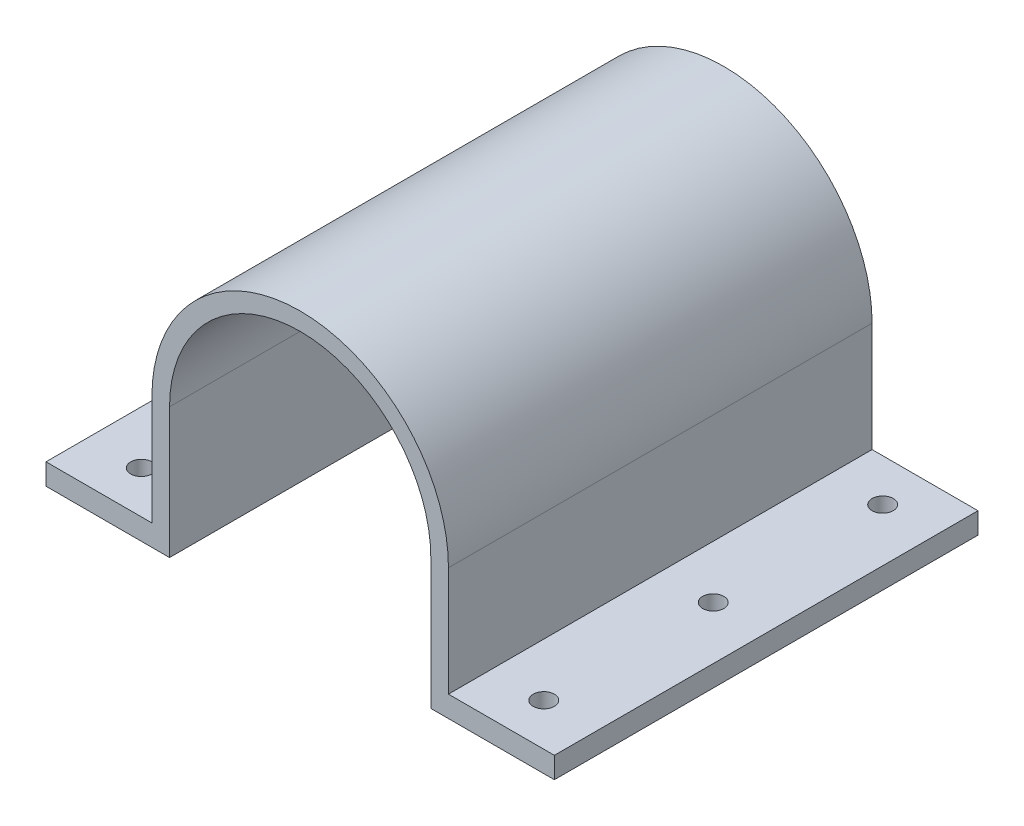
ISO-10303-21;
HEADER;
FILE_DESCRIPTION(('STEP AP214'),'2;1');
FILE_NAME('part.step','',(''),(''),'','','');
FILE_SCHEMA(('AUTOMOTIVE_DESIGN { 1 0 10303 214 1 1 1 1 }'));
ENDSEC;
DATA;
#1=APPLICATION_CONTEXT('core data for automotive mechanical design processes');
#2=APPLICATION_PROTOCOL_DEFINITION('international standard','automotive_design',2000,#1);
#3=PRODUCT_CONTEXT('',#1,'mechanical');
#4=PRODUCT('Part','Part','',(#3));
#5=PRODUCT_RELATED_PRODUCT_CATEGORY('part','',(#4));
#6=PRODUCT_DEFINITION_FORMATION('','',#4);
#7=PRODUCT_DEFINITION_CONTEXT('part definition',#1,'design');
#8=PRODUCT_DEFINITION('design','',#6,#7);
#9=PRODUCT_DEFINITION_SHAPE('','',#8);
#10=(LENGTH_UNIT() NAMED_UNIT(*) SI_UNIT(.MILLI.,.METRE.));
#11=(NAMED_UNIT(*) PLANE_ANGLE_UNIT() SI_UNIT($,.RADIAN.));
#12=(NAMED_UNIT(*) SI_UNIT($,.STERADIAN.) SOLID_ANGLE_UNIT());
#13=UNCERTAINTY_MEASURE_WITH_UNIT(LENGTH_MEASURE(1.E-05),#10,'distance_accuracy_value','');
#14=(GEOMETRIC_REPRESENTATION_CONTEXT(3) GLOBAL_UNCERTAINTY_ASSIGNED_CONTEXT((#13)) GLOBAL_UNIT_ASSIGNED_CONTEXT((#10,
#11,#12)) REPRESENTATION_CONTEXT('',''));
#15=CARTESIAN_POINT('',(0.,0.,0.));
#16=DIRECTION('',(0.,0.,1.));
#17=DIRECTION('',(1.,0.,0.));
#18=AXIS2_PLACEMENT_3D('',#15,#16,#17);
#19=CARTESIAN_POINT('',(-15.5,0.,60.));
#20=DIRECTION('',(0.,0.,-1.));
#21=DIRECTION('',(-1.,0.,0.));
#22=AXIS2_PLACEMENT_3D('',#19,#20,#21);
#23=CYLINDRICAL_SURFACE('',#22,1.65);
#24=CARTESIAN_POINT('',(-15.5,0.,0.));
#25=DIRECTION('',(0.,0.,1.));
#26=DIRECTION('',(1.,0.,0.));
#27=AXIS2_PLACEMENT_3D('',#24,#25,#26);
#28=CIRCLE('',#27,1.65);
#29=CARTESIAN_POINT('',(-13.85,0.,0.));
#30=VERTEX_POINT('',#29);
#31=EDGE_CURVE('E156',#30,#30,#28,.T.);
#32=ORIENTED_EDGE('',*,*,#31,.F.);
#33=EDGE_LOOP('',(#32));
#34=FACE_BOUND('',#33,.T.);
#35=CARTESIAN_POINT('',(-15.5,0.,3.));
#36=DIRECTION('',(0.,0.,1.));
#37=DIRECTION('',(1.,0.,0.));
#38=AXIS2_PLACEMENT_3D('',#35,#36,#37);
#39=CIRCLE('',#38,1.65);
#40=CARTESIAN_POINT('',(-13.85,0.,3.));
#41=VERTEX_POINT('',#40);
#42=EDGE_CURVE('E230',#41,#41,#39,.T.);
#43=ORIENTED_EDGE('',*,*,#42,.T.);
#44=EDGE_LOOP('',(#43));
#45=FACE_BOUND('',#44,.T.);
#46=ADVANCED_FACE('F40',(#34,#45),#23,.F.);
#47=CARTESIAN_POINT('',(0.,7.,60.));
#48=DIRECTION('',(0.,0.,-1.));
#49=DIRECTION('',(-1.,0.,0.));
#50=AXIS2_PLACEMENT_3D('',#47,#48,#49);
#51=CYLINDRICAL_SURFACE('',#50,6.15);
#52=CARTESIAN_POINT('',(0.,7.,0.));
#53=DIRECTION('',(0.,0.,1.));
#54=DIRECTION('',(1.,0.,0.));
#55=AXIS2_PLACEMENT_3D('',#52,#53,#54);
#56=CIRCLE('',#55,6.15);
#57=CARTESIAN_POINT('',(6.15,7.,0.));
#58=VERTEX_POINT('',#57);
#59=EDGE_CURVE('E212',#58,#58,#56,.T.);
#60=ORIENTED_EDGE('',*,*,#59,.F.);
#61=EDGE_LOOP('',(#60));
#62=FACE_BOUND('',#61,.T.);
#63=CARTESIAN_POINT('',(0.,7.,3.));
#64=DIRECTION('',(0.,0.,1.));
#65=DIRECTION('',(1.,0.,0.));
#66=AXIS2_PLACEMENT_3D('',#63,#64,#65);
#67=CIRCLE('',#66,6.15);
#68=CARTESIAN_POINT('',(6.15,7.,3.));
#69=VERTEX_POINT('',#68);
#70=EDGE_CURVE('E233',#69,#69,#67,.T.);
#71=ORIENTED_EDGE('',*,*,#70,.T.);
#72=EDGE_LOOP('',(#71));
#73=FACE_BOUND('',#72,.T.);
#74=ADVANCED_FACE('F330',(#62,#73),#51,.F.);
#75=CARTESIAN_POINT('',(-7.75,13.4233937586588,60.));
#76=DIRECTION('',(0.,0.,-1.));
#77=DIRECTION('',(-1.,0.,0.));
#78=AXIS2_PLACEMENT_3D('',#75,#76,#77);
#79=CYLINDRICAL_SURFACE('',#78,1.65);
#80=CARTESIAN_POINT('',(-7.75,13.4233937586588,0.));
#81=DIRECTION('',(0.,0.,1.));
#82=DIRECTION('',(1.,0.,0.));
#83=AXIS2_PLACEMENT_3D('',#80,#81,#82);
#84=CIRCLE('',#83,1.65);
#85=CARTESIAN_POINT('',(-6.1,13.4233937586588,0.));
#86=VERTEX_POINT('',#85);
#87=EDGE_CURVE('E215',#86,#86,#84,.T.);
#88=ORIENTED_EDGE('',*,*,#87,.F.);
#89=EDGE_LOOP('',(#88));
#90=FACE_BOUND('',#89,.T.);
#91=CARTESIAN_POINT('',(-7.75,13.4233937586588,3.));
#92=DIRECTION('',(0.,0.,1.));
#93=DIRECTION('',(1.,0.,0.));
#94=AXIS2_PLACEMENT_3D('',#91,#92,#93);
#95=CIRCLE('',#94,1.65);
#96=CARTESIAN_POINT('',(-6.1,13.4233937586588,3.));
#97=VERTEX_POINT('',#96);
#98=EDGE_CURVE('E236',#97,#97,#95,.T.);
#99=ORIENTED_EDGE('',*,*,#98,.T.);
#100=EDGE_LOOP('',(#99));
#101=FACE_BOUND('',#100,.T.);
#102=ADVANCED_FACE('F336',(#90,#101),#79,.F.);
#103=CARTESIAN_POINT('',(7.75,13.4233937586588,60.));
#104=DIRECTION('',(0.,0.,-1.));
#105=DIRECTION('',(-1.,0.,0.));
#106=AXIS2_PLACEMENT_3D('',#103,#104,#105);
#107=CYLINDRICAL_SURFACE('',#106,1.65);
#108=CARTESIAN_POINT('',(7.75,13.4233937586588,0.));
#109=DIRECTION('',(0.,0.,1.));
#110=DIRECTION('',(1.,0.,0.));
#111=AXIS2_PLACEMENT_3D('',#108,#109,#110);
#112=CIRCLE('',#111,1.65);
#113=CARTESIAN_POINT('',(9.4,13.4233937586588,0.));
#114=VERTEX_POINT('',#113);
#115=EDGE_CURVE('E218',#114,#114,#112,.T.);
#116=ORIENTED_EDGE('',*,*,#115,.F.);
#117=EDGE_LOOP('',(#116));
#118=FACE_BOUND('',#117,.T.);
#119=CARTESIAN_POINT('',(7.75,13.4233937586588,3.));
#120=DIRECTION('',(0.,0.,1.));
#121=DIRECTION('',(1.,0.,0.));
#122=AXIS2_PLACEMENT_3D('',#119,#120,#121);
#123=CIRCLE('',#122,1.65);
#124=CARTESIAN_POINT('',(9.4,13.4233937586588,3.));
#125=VERTEX_POINT('',#124);
#126=EDGE_CURVE('E239',#125,#125,#123,.T.);
#127=ORIENTED_EDGE('',*,*,#126,.T.);
#128=EDGE_LOOP('',(#127));
#129=FACE_BOUND('',#128,.T.);
#130=ADVANCED_FACE('F425',(#118,#129),#107,.F.);
#131=CARTESIAN_POINT('',(15.5,0.,60.));
#132=DIRECTION('',(0.,0.,-1.));
#133=DIRECTION('',(-1.,0.,0.));
#134=AXIS2_PLACEMENT_3D('',#131,#132,#133);
#135=CYLINDRICAL_SURFACE('',#134,1.65);
#136=CARTESIAN_POINT('',(15.5,0.,0.));
#137=DIRECTION('',(0.,0.,1.));
#138=DIRECTION('',(1.,0.,0.));
#139=AXIS2_PLACEMENT_3D('',#136,#137,#138);
#140=CIRCLE('',#139,1.65);
#141=CARTESIAN_POINT('',(17.15,0.,0.));
#142=VERTEX_POINT('',#141);
#143=EDGE_CURVE('E221',#142,#142,#140,.T.);
#144=ORIENTED_EDGE('',*,*,#143,.F.);
#145=EDGE_LOOP('',(#144));
#146=FACE_BOUND('',#145,.T.);
#147=CARTESIAN_POINT('',(15.5,0.,3.));
#148=DIRECTION('',(0.,0.,1.));
#149=DIRECTION('',(1.,0.,0.));
#150=AXIS2_PLACEMENT_3D('',#147,#148,#149);
#151=CIRCLE('',#150,1.65);
#152=CARTESIAN_POINT('',(17.15,0.,3.));
#153=VERTEX_POINT('',#152);
#154=EDGE_CURVE('E242',#153,#153,#151,.T.);
#155=ORIENTED_EDGE('',*,*,#154,.T.);
#156=EDGE_LOOP('',(#155));
#157=FACE_BOUND('',#156,.T.);
#158=ADVANCED_FACE('F421',(#146,#157),#135,.F.);
#159=CARTESIAN_POINT('',(7.75000000000001,-13.4233937586588,60.));
#160=DIRECTION('',(0.,0.,-1.));
#161=DIRECTION('',(-1.,0.,0.));
#162=AXIS2_PLACEMENT_3D('',#159,#160,#161);
#163=CYLINDRICAL_SURFACE('',#162,1.65);
#164=CARTESIAN_POINT('',(7.75000000000001,-13.4233937586588,0.));
#165=DIRECTION('',(0.,0.,1.));
#166=DIRECTION('',(1.,0.,0.));
#167=AXIS2_PLACEMENT_3D('',#164,#165,#166);
#168=CIRCLE('',#167,1.65);
#169=CARTESIAN_POINT('',(9.40000000000001,-13.4233937586588,0.));
#170=VERTEX_POINT('',#169);
#171=EDGE_CURVE('E224',#170,#170,#168,.T.);
#172=ORIENTED_EDGE('',*,*,#171,.F.);
#173=EDGE_LOOP('',(#172));
#174=FACE_BOUND('',#173,.T.);
#175=CARTESIAN_POINT('',(7.75000000000001,-13.4233937586588,3.));
#176=DIRECTION('',(0.,0.,1.));
#177=DIRECTION('',(1.,0.,0.));
#178=AXIS2_PLACEMENT_3D('',#175,#176,#177);
#179=CIRCLE('',#178,1.65);
#180=CARTESIAN_POINT('',(9.40000000000001,-13.4233937586588,3.));
#181=VERTEX_POINT('',#180);
#182=EDGE_CURVE('E245',#181,#181,#179,.T.);
#183=ORIENTED_EDGE('',*,*,#182,.T.);
#184=EDGE_LOOP('',(#183));
#185=FACE_BOUND('',#184,.T.);
#186=ADVANCED_FACE('F417',(#174,#185),#163,.F.);
#187=CARTESIAN_POINT('',(-7.74999999999999,-13.4233937586588,60.));
#188=DIRECTION('',(0.,0.,-1.));
#189=DIRECTION('',(-1.,0.,0.));
#190=AXIS2_PLACEMENT_3D('',#187,#188,#189);
#191=CYLINDRICAL_SURFACE('',#190,1.65);
#192=CARTESIAN_POINT('',(-7.74999999999999,-13.4233937586588,0.));
#193=DIRECTION('',(0.,0.,1.));
#194=DIRECTION('',(1.,0.,0.));
#195=AXIS2_PLACEMENT_3D('',#192,#193,#194);
#196=CIRCLE('',#195,1.65);
#197=CARTESIAN_POINT('',(-6.09999999999999,-13.4233937586588,0.));
#198=VERTEX_POINT('',#197);
#199=EDGE_CURVE('E227',#198,#198,#196,.T.);
#200=ORIENTED_EDGE('',*,*,#199,.F.);
#201=EDGE_LOOP('',(#200));
#202=FACE_BOUND('',#201,.T.);
#203=CARTESIAN_POINT('',(-7.74999999999999,-13.4233937586588,3.));
#204=DIRECTION('',(0.,0.,1.));
#205=DIRECTION('',(1.,0.,0.));
#206=AXIS2_PLACEMENT_3D('',#203,#204,#205);
#207=CIRCLE('',#206,1.65);
#208=CARTESIAN_POINT('',(-6.09999999999999,-13.4233937586588,3.));
#209=VERTEX_POINT('',#208);
#210=EDGE_CURVE('E44',#209,#209,#207,.T.);
#211=ORIENTED_EDGE('',*,*,#210,.T.);
#212=EDGE_LOOP('',(#211));
#213=FACE_BOUND('',#212,.T.);
#214=ADVANCED_FACE('F345',(#202,#213),#191,.F.);
#215=CARTESIAN_POINT('',(0.,0.,60.));
#216=DIRECTION('',(0.,0.,1.));
#217=DIRECTION('',(1.,0.,0.));
#218=AXIS2_PLACEMENT_3D('',#215,#216,#217);
#219=PLANE('',#218);
#220=DIRECTION('',(0.,1.,0.));
#221=VECTOR('',#220,1.);
#222=CARTESIAN_POINT('',(18.5,-18.5,60.));
#223=LINE('',#222,#221);
#224=CARTESIAN_POINT('',(18.5,-18.5,60.));
#225=VERTEX_POINT('',#224);
#226=CARTESIAN_POINT('',(18.5,0.,60.));
#227=VERTEX_POINT('',#226);
#228=EDGE_CURVE('E259',#225,#227,#223,.T.);
#229=ORIENTED_EDGE('',*,*,#228,.F.);
#230=DIRECTION('',(1.,0.,0.));
#231=VECTOR('',#230,1.);
#232=CARTESIAN_POINT('',(-36.,-18.5,60.));
#233=LINE('',#232,#231);
#234=CARTESIAN_POINT('',(36.,-18.5,60.));
#235=VERTEX_POINT('',#234);
#236=EDGE_CURVE('E130',#225,#235,#233,.T.);
#237=ORIENTED_EDGE('',*,*,#236,.T.);
#238=DIRECTION('',(0.,1.,0.));
#239=VECTOR('',#238,1.);
#240=CARTESIAN_POINT('',(36.,-18.5,60.));
#241=LINE('',#240,#239);
#242=CARTESIAN_POINT('',(36.,-15.5,60.));
#243=VERTEX_POINT('',#242);
#244=EDGE_CURVE('E122',#235,#243,#241,.T.);
#245=ORIENTED_EDGE('',*,*,#244,.T.);
#246=DIRECTION('',(-1.,0.,0.));
#247=VECTOR('',#246,1.);
#248=CARTESIAN_POINT('',(36.,-15.5,60.));
#249=LINE('',#248,#247);
#250=CARTESIAN_POINT('',(21.,-15.5,60.));
#251=VERTEX_POINT('',#250);
#252=EDGE_CURVE('E127',#243,#251,#249,.T.);
#253=ORIENTED_EDGE('',*,*,#252,.T.);
#254=DIRECTION('',(0.,1.,0.));
#255=VECTOR('',#254,1.);
#256=CARTESIAN_POINT('',(21.,-15.5,60.));
#257=LINE('',#256,#255);
#258=CARTESIAN_POINT('',(21.,0.,60.));
#259=VERTEX_POINT('',#258);
#260=EDGE_CURVE('E65',#251,#259,#257,.T.);
#261=ORIENTED_EDGE('',*,*,#260,.T.);
#262=CARTESIAN_POINT('',(0.,0.,60.));
#263=DIRECTION('',(0.,0.,1.));
#264=DIRECTION('',(1.,0.,0.));
#265=AXIS2_PLACEMENT_3D('',#262,#263,#264);
#266=CIRCLE('',#265,21.);
#267=CARTESIAN_POINT('',(-21.,0.,60.));
#268=VERTEX_POINT('',#267);
#269=EDGE_CURVE('E168',#259,#268,#266,.T.);
#270=ORIENTED_EDGE('',*,*,#269,.T.);
#271=DIRECTION('',(0.,-1.,0.));
#272=VECTOR('',#271,1.);
#273=CARTESIAN_POINT('',(-21.,0.,60.));
#274=LINE('',#273,#272);
#275=CARTESIAN_POINT('',(-21.,-15.5,60.));
#276=VERTEX_POINT('',#275);
#277=EDGE_CURVE('E106',#268,#276,#274,.T.);
#278=ORIENTED_EDGE('',*,*,#277,.T.);
#279=DIRECTION('',(-1.,0.,0.));
#280=VECTOR('',#279,1.);
#281=CARTESIAN_POINT('',(-21.,-15.5,60.));
#282=LINE('',#281,#280);
#283=CARTESIAN_POINT('',(-36.,-15.5,60.));
#284=VERTEX_POINT('',#283);
#285=EDGE_CURVE('E184',#276,#284,#282,.T.);
#286=ORIENTED_EDGE('',*,*,#285,.T.);
#287=DIRECTION('',(0.,-1.,0.));
#288=VECTOR('',#287,1.);
#289=CARTESIAN_POINT('',(-36.,-15.5,60.));
#290=LINE('',#289,#288);
#291=CARTESIAN_POINT('',(-36.,-18.5,60.));
#292=VERTEX_POINT('',#291);
#293=EDGE_CURVE('E204',#284,#292,#290,.T.);
#294=ORIENTED_EDGE('',*,*,#293,.T.);
#295=CARTESIAN_POINT('',(-18.5,-18.5,60.));
#296=VERTEX_POINT('',#295);
#297=EDGE_CURVE('E134',#292,#296,#233,.T.);
#298=ORIENTED_EDGE('',*,*,#297,.T.);
#299=DIRECTION('',(0.,-1.,0.));
#300=VECTOR('',#299,1.);
#301=CARTESIAN_POINT('',(-18.5,0.,60.));
#302=LINE('',#301,#300);
#303=CARTESIAN_POINT('',(-18.5,0.,60.));
#304=VERTEX_POINT('',#303);
#305=EDGE_CURVE('E263',#304,#296,#302,.T.);
#306=ORIENTED_EDGE('',*,*,#305,.F.);
#307=CARTESIAN_POINT('',(0.,0.,60.));
#308=DIRECTION('',(0.,0.,1.));
#309=DIRECTION('',(1.,0.,0.));
#310=AXIS2_PLACEMENT_3D('',#307,#308,#309);
#311=CIRCLE('',#310,18.5);
#312=EDGE_CURVE('E266',#227,#304,#311,.T.);
#313=ORIENTED_EDGE('',*,*,#312,.F.);
#314=EDGE_LOOP('',(#229,#237,#245,#253,#261,#270,#278,#286,#294,#298,#306,#313));
#315=FACE_BOUND('',#314,.T.);
#316=ADVANCED_FACE('F125',(#315),#219,.T.);
#317=CARTESIAN_POINT('',(0.,0.,0.));
#318=DIRECTION('',(0.,0.,1.));
#319=DIRECTION('',(1.,0.,0.));
#320=AXIS2_PLACEMENT_3D('',#317,#318,#319);
#321=PLANE('',#320);
#322=CARTESIAN_POINT('',(0.,0.,0.));
#323=DIRECTION('',(0.,0.,1.));
#324=DIRECTION('',(1.,0.,0.));
#325=AXIS2_PLACEMENT_3D('',#322,#323,#324);
#326=CIRCLE('',#325,21.);
#327=CARTESIAN_POINT('',(21.,0.,0.));
#328=VERTEX_POINT('',#327);
#329=CARTESIAN_POINT('',(-21.,0.,0.));
#330=VERTEX_POINT('',#329);
#331=EDGE_CURVE('E152',#328,#330,#326,.T.);
#332=ORIENTED_EDGE('',*,*,#331,.F.);
#333=DIRECTION('',(0.,1.,0.));
#334=VECTOR('',#333,1.);
#335=CARTESIAN_POINT('',(21.,-15.5,0.));
#336=LINE('',#335,#334);
#337=CARTESIAN_POINT('',(21.,-15.5,0.));
#338=VERTEX_POINT('',#337);
#339=EDGE_CURVE('E98',#338,#328,#336,.T.);
#340=ORIENTED_EDGE('',*,*,#339,.F.);
#341=DIRECTION('',(-1.,0.,0.));
#342=VECTOR('',#341,1.);
#343=CARTESIAN_POINT('',(36.,-15.5,0.));
#344=LINE('',#343,#342);
#345=CARTESIAN_POINT('',(36.,-15.5,0.));
#346=VERTEX_POINT('',#345);
#347=EDGE_CURVE('E165',#346,#338,#344,.T.);
#348=ORIENTED_EDGE('',*,*,#347,.F.);
#349=DIRECTION('',(0.,1.,0.));
#350=VECTOR('',#349,1.);
#351=CARTESIAN_POINT('',(36.,-18.5,0.));
#352=LINE('',#351,#350);
#353=CARTESIAN_POINT('',(36.,-18.5,0.));
#354=VERTEX_POINT('',#353);
#355=EDGE_CURVE('E140',#354,#346,#352,.T.);
#356=ORIENTED_EDGE('',*,*,#355,.F.);
#357=DIRECTION('',(1.,0.,0.));
#358=VECTOR('',#357,1.);
#359=CARTESIAN_POINT('',(-36.,-18.5,0.));
#360=LINE('',#359,#358);
#361=CARTESIAN_POINT('',(-36.,-18.5,0.));
#362=VERTEX_POINT('',#361);
#363=EDGE_CURVE('E162',#362,#354,#360,.T.);
#364=ORIENTED_EDGE('',*,*,#363,.F.);
#365=DIRECTION('',(0.,-1.,0.));
#366=VECTOR('',#365,1.);
#367=CARTESIAN_POINT('',(-36.,-15.5,0.));
#368=LINE('',#367,#366);
#369=CARTESIAN_POINT('',(-36.,-15.5,0.));
#370=VERTEX_POINT('',#369);
#371=EDGE_CURVE('E160',#370,#362,#368,.T.);
#372=ORIENTED_EDGE('',*,*,#371,.F.);
#373=DIRECTION('',(-1.,0.,0.));
#374=VECTOR('',#373,1.);
#375=CARTESIAN_POINT('',(-21.,-15.5,0.));
#376=LINE('',#375,#374);
#377=CARTESIAN_POINT('',(-21.,-15.5,0.));
#378=VERTEX_POINT('',#377);
#379=EDGE_CURVE('E158',#378,#370,#376,.T.);
#380=ORIENTED_EDGE('',*,*,#379,.F.);
#381=DIRECTION('',(0.,-1.,0.));
#382=VECTOR('',#381,1.);
#383=CARTESIAN_POINT('',(-21.,0.,0.));
#384=LINE('',#383,#382);
#385=EDGE_CURVE('E155',#330,#378,#384,.T.);
#386=ORIENTED_EDGE('',*,*,#385,.F.);
#387=EDGE_LOOP('',(#332,#340,#348,#356,#364,#372,#380,#386));
#388=FACE_BOUND('',#387,.T.);
#389=ORIENTED_EDGE('',*,*,#31,.T.);
#390=EDGE_LOOP('',(#389));
#391=FACE_BOUND('',#390,.T.);
#392=ORIENTED_EDGE('',*,*,#59,.T.);
#393=EDGE_LOOP('',(#392));
#394=FACE_BOUND('',#393,.T.);
#395=ORIENTED_EDGE('',*,*,#87,.T.);
#396=EDGE_LOOP('',(#395));
#397=FACE_BOUND('',#396,.T.);
#398=ORIENTED_EDGE('',*,*,#115,.T.);
#399=EDGE_LOOP('',(#398));
#400=FACE_BOUND('',#399,.T.);
#401=ORIENTED_EDGE('',*,*,#143,.T.);
#402=EDGE_LOOP('',(#401));
#403=FACE_BOUND('',#402,.T.);
#404=ORIENTED_EDGE('',*,*,#171,.T.);
#405=EDGE_LOOP('',(#404));
#406=FACE_BOUND('',#405,.T.);
#407=ORIENTED_EDGE('',*,*,#199,.T.);
#408=EDGE_LOOP('',(#407));
#409=FACE_BOUND('',#408,.T.);
#410=ADVANCED_FACE('F188',(#388,#391,#394,#397,#400,#403,#406,#409),#321,.F.);
#411=CARTESIAN_POINT('',(0.,0.,60.));
#412=DIRECTION('',(0.,0.,-1.));
#413=DIRECTION('',(-1.,0.,0.));
#414=AXIS2_PLACEMENT_3D('',#411,#412,#413);
#415=CYLINDRICAL_SURFACE('',#414,21.);
#416=ORIENTED_EDGE('',*,*,#331,.T.);
#417=DIRECTION('',(0.,0.,-1.));
#418=VECTOR('',#417,1.);
#419=CARTESIAN_POINT('',(-21.,0.,60.));
#420=LINE('',#419,#418);
#421=EDGE_CURVE('E11',#268,#330,#420,.T.);
#422=ORIENTED_EDGE('',*,*,#421,.F.);
#423=ORIENTED_EDGE('',*,*,#269,.F.);
#424=DIRECTION('',(0.,0.,-1.));
#425=VECTOR('',#424,1.);
#426=CARTESIAN_POINT('',(21.,0.,60.));
#427=LINE('',#426,#425);
#428=EDGE_CURVE('E148',#259,#328,#427,.T.);
#429=ORIENTED_EDGE('',*,*,#428,.T.);
#430=EDGE_LOOP('',(#416,#422,#423,#429));
#431=FACE_BOUND('',#430,.T.);
#432=ADVANCED_FACE('F42',(#431),#415,.T.);
#433=CARTESIAN_POINT('',(-21.,0.,60.));
#434=DIRECTION('',(1.,0.,0.));
#435=DIRECTION('',(0.,1.,0.));
#436=AXIS2_PLACEMENT_3D('',#433,#434,#435);
#437=PLANE('',#436);
#438=ORIENTED_EDGE('',*,*,#385,.T.);
#439=DIRECTION('',(0.,0.,-1.));
#440=VECTOR('',#439,1.);
#441=CARTESIAN_POINT('',(-21.,-15.5,60.));
#442=LINE('',#441,#440);
#443=EDGE_CURVE('E49',#276,#378,#442,.T.);
#444=ORIENTED_EDGE('',*,*,#443,.F.);
#445=ORIENTED_EDGE('',*,*,#277,.F.);
#446=ORIENTED_EDGE('',*,*,#421,.T.);
#447=EDGE_LOOP('',(#438,#444,#445,#446));
#448=FACE_BOUND('',#447,.T.);
#449=ADVANCED_FACE('F350',(#448),#437,.F.);
#450=CARTESIAN_POINT('',(-21.,-15.5,60.));
#451=DIRECTION('',(0.,-1.,0.));
#452=DIRECTION('',(1.,0.,0.));
#453=AXIS2_PLACEMENT_3D('',#450,#451,#452);
#454=PLANE('',#453);
#455=CARTESIAN_POINT('',(-28.5,-15.5,6.));
#456=DIRECTION('',(0.,1.,0.));
#457=DIRECTION('',(0.,0.,1.));
#458=AXIS2_PLACEMENT_3D('',#455,#456,#457);
#459=CIRCLE('',#458,1.5);
#460=CARTESIAN_POINT('',(-28.5,-15.5,7.5));
#461=VERTEX_POINT('',#460);
#462=EDGE_CURVE('E279',#461,#461,#459,.T.);
#463=ORIENTED_EDGE('',*,*,#462,.F.);
#464=EDGE_LOOP('',(#463));
#465=FACE_BOUND('',#464,.T.);
#466=CARTESIAN_POINT('',(-28.5,-15.5,54.));
#467=DIRECTION('',(0.,1.,0.));
#468=DIRECTION('',(0.,0.,1.));
#469=AXIS2_PLACEMENT_3D('',#466,#467,#468);
#470=CIRCLE('',#469,1.5);
#471=CARTESIAN_POINT('',(-28.5,-15.5,55.5));
#472=VERTEX_POINT('',#471);
#473=EDGE_CURVE('E298',#472,#472,#470,.T.);
#474=ORIENTED_EDGE('',*,*,#473,.F.);
#475=EDGE_LOOP('',(#474));
#476=FACE_BOUND('',#475,.T.);
#477=CARTESIAN_POINT('',(-28.5,-15.5,30.));
#478=DIRECTION('',(0.,1.,0.));
#479=DIRECTION('',(0.,0.,1.));
#480=AXIS2_PLACEMENT_3D('',#477,#478,#479);
#481=CIRCLE('',#480,1.5);
#482=CARTESIAN_POINT('',(-28.5,-15.5,31.5));
#483=VERTEX_POINT('',#482);
#484=EDGE_CURVE('E276',#483,#483,#481,.T.);
#485=ORIENTED_EDGE('',*,*,#484,.F.);
#486=EDGE_LOOP('',(#485));
#487=FACE_BOUND('',#486,.T.);
#488=ORIENTED_EDGE('',*,*,#379,.T.);
#489=DIRECTION('',(0.,0.,-1.));
#490=VECTOR('',#489,1.);
#491=CARTESIAN_POINT('',(-36.,-15.5,60.));
#492=LINE('',#491,#490);
#493=EDGE_CURVE('E175',#284,#370,#492,.T.);
#494=ORIENTED_EDGE('',*,*,#493,.F.);
#495=ORIENTED_EDGE('',*,*,#285,.F.);
#496=ORIENTED_EDGE('',*,*,#443,.T.);
#497=EDGE_LOOP('',(#488,#494,#495,#496));
#498=FACE_BOUND('',#497,.T.);
#499=ADVANCED_FACE('F182',(#465,#476,#487,#498),#454,.F.);
#500=CARTESIAN_POINT('',(-36.,-15.5,60.));
#501=DIRECTION('',(1.,0.,0.));
#502=DIRECTION('',(0.,0.,-1.));
#503=AXIS2_PLACEMENT_3D('',#500,#501,#502);
#504=PLANE('',#503);
#505=ORIENTED_EDGE('',*,*,#371,.T.);
#506=DIRECTION('',(0.,0.,-1.));
#507=VECTOR('',#506,1.);
#508=CARTESIAN_POINT('',(-36.,-18.5,60.));
#509=LINE('',#508,#507);
#510=EDGE_CURVE('E172',#292,#362,#509,.T.);
#511=ORIENTED_EDGE('',*,*,#510,.F.);
#512=ORIENTED_EDGE('',*,*,#293,.F.);
#513=ORIENTED_EDGE('',*,*,#493,.T.);
#514=EDGE_LOOP('',(#505,#511,#512,#513));
#515=FACE_BOUND('',#514,.T.);
#516=ADVANCED_FACE('F193',(#515),#504,.F.);
#517=CARTESIAN_POINT('',(-36.,-18.5,60.));
#518=DIRECTION('',(0.,1.,0.));
#519=DIRECTION('',(0.,0.,1.));
#520=AXIS2_PLACEMENT_3D('',#517,#518,#519);
#521=PLANE('',#520);
#522=CARTESIAN_POINT('',(-28.5,-18.5,6.));
#523=DIRECTION('',(0.,1.,0.));
#524=DIRECTION('',(0.,0.,1.));
#525=AXIS2_PLACEMENT_3D('',#522,#523,#524);
#526=CIRCLE('',#525,1.5);
#527=CARTESIAN_POINT('',(-28.5,-18.5,7.5));
#528=VERTEX_POINT('',#527);
#529=EDGE_CURVE('E301',#528,#528,#526,.T.);
#530=ORIENTED_EDGE('',*,*,#529,.T.);
#531=EDGE_LOOP('',(#530));
#532=FACE_BOUND('',#531,.T.);
#533=CARTESIAN_POINT('',(-28.5,-18.5,54.));
#534=DIRECTION('',(0.,1.,0.));
#535=DIRECTION('',(0.,0.,1.));
#536=AXIS2_PLACEMENT_3D('',#533,#534,#535);
#537=CIRCLE('',#536,1.5);
#538=CARTESIAN_POINT('',(-28.5,-18.5,55.5));
#539=VERTEX_POINT('',#538);
#540=EDGE_CURVE('E295',#539,#539,#537,.T.);
#541=ORIENTED_EDGE('',*,*,#540,.T.);
#542=EDGE_LOOP('',(#541));
#543=FACE_BOUND('',#542,.T.);
#544=CARTESIAN_POINT('',(28.5,-18.5,54.));
#545=DIRECTION('',(0.,1.,0.));
#546=DIRECTION('',(0.,0.,-1.));
#547=AXIS2_PLACEMENT_3D('',#544,#545,#546);
#548=CIRCLE('',#547,1.5);
#549=CARTESIAN_POINT('',(28.5,-18.5,52.5));
#550=VERTEX_POINT('',#549);
#551=EDGE_CURVE('E289',#550,#550,#548,.T.);
#552=ORIENTED_EDGE('',*,*,#551,.T.);
#553=EDGE_LOOP('',(#552));
#554=FACE_BOUND('',#553,.T.);
#555=CARTESIAN_POINT('',(28.5,-18.5,6.00000000000001));
#556=DIRECTION('',(0.,1.,0.));
#557=DIRECTION('',(0.,0.,-1.));
#558=AXIS2_PLACEMENT_3D('',#555,#556,#557);
#559=CIRCLE('',#558,1.5);
#560=CARTESIAN_POINT('',(28.5,-18.5,4.50000000000001));
#561=VERTEX_POINT('',#560);
#562=EDGE_CURVE('E282',#561,#561,#559,.T.);
#563=ORIENTED_EDGE('',*,*,#562,.T.);
#564=EDGE_LOOP('',(#563));
#565=FACE_BOUND('',#564,.T.);
#566=CARTESIAN_POINT('',(28.5,-18.5,30.));
#567=DIRECTION('',(0.,1.,0.));
#568=DIRECTION('',(0.,0.,-1.));
#569=AXIS2_PLACEMENT_3D('',#566,#567,#568);
#570=CIRCLE('',#569,1.5);
#571=CARTESIAN_POINT('',(28.5,-18.5,28.5));
#572=VERTEX_POINT('',#571);
#573=EDGE_CURVE('E306',#572,#572,#570,.T.);
#574=ORIENTED_EDGE('',*,*,#573,.T.);
#575=EDGE_LOOP('',(#574));
#576=FACE_BOUND('',#575,.T.);
#577=CARTESIAN_POINT('',(-28.5,-18.5,30.));
#578=DIRECTION('',(0.,1.,0.));
#579=DIRECTION('',(0.,0.,1.));
#580=AXIS2_PLACEMENT_3D('',#577,#578,#579);
#581=CIRCLE('',#580,1.5);
#582=CARTESIAN_POINT('',(-28.5,-18.5,31.5));
#583=VERTEX_POINT('',#582);
#584=EDGE_CURVE('E269',#583,#583,#581,.T.);
#585=ORIENTED_EDGE('',*,*,#584,.T.);
#586=EDGE_LOOP('',(#585));
#587=FACE_BOUND('',#586,.T.);
#588=ORIENTED_EDGE('',*,*,#236,.F.);
#589=DIRECTION('',(0.,0.,1.));
#590=VECTOR('',#589,1.);
#591=CARTESIAN_POINT('',(18.5,-18.5,3.));
#592=LINE('',#591,#590);
#593=CARTESIAN_POINT('',(18.5,-18.5,3.));
#594=VERTEX_POINT('',#593);
#595=EDGE_CURVE('E253',#594,#225,#592,.T.);
#596=ORIENTED_EDGE('',*,*,#595,.F.);
#597=DIRECTION('',(1.,0.,0.));
#598=VECTOR('',#597,1.);
#599=CARTESIAN_POINT('',(-18.5,-18.5,3.));
#600=LINE('',#599,#598);
#601=CARTESIAN_POINT('',(-18.5,-18.5,3.));
#602=VERTEX_POINT('',#601);
#603=EDGE_CURVE('E272',#602,#594,#600,.T.);
#604=ORIENTED_EDGE('',*,*,#603,.F.);
#605=DIRECTION('',(0.,0.,1.));
#606=VECTOR('',#605,1.);
#607=CARTESIAN_POINT('',(-18.5,-18.5,3.));
#608=LINE('',#607,#606);
#609=EDGE_CURVE('E202',#602,#296,#608,.T.);
#610=ORIENTED_EDGE('',*,*,#609,.T.);
#611=ORIENTED_EDGE('',*,*,#297,.F.);
#612=ORIENTED_EDGE('',*,*,#510,.T.);
#613=ORIENTED_EDGE('',*,*,#363,.T.);
#614=DIRECTION('',(0.,0.,-1.));
#615=VECTOR('',#614,1.);
#616=CARTESIAN_POINT('',(36.,-18.5,60.));
#617=LINE('',#616,#615);
#618=EDGE_CURVE('E143',#235,#354,#617,.T.);
#619=ORIENTED_EDGE('',*,*,#618,.F.);
#620=EDGE_LOOP('',(#588,#596,#604,#610,#611,#612,#613,#619));
#621=FACE_BOUND('',#620,.T.);
#622=ADVANCED_FACE('F197',(#532,#543,#554,#565,#576,#587,#621),#521,.F.);
#623=CARTESIAN_POINT('',(36.,-18.5,60.));
#624=DIRECTION('',(-1.,0.,0.));
#625=DIRECTION('',(0.,0.,1.));
#626=AXIS2_PLACEMENT_3D('',#623,#624,#625);
#627=PLANE('',#626);
#628=ORIENTED_EDGE('',*,*,#355,.T.);
#629=DIRECTION('',(0.,0.,-1.));
#630=VECTOR('',#629,1.);
#631=CARTESIAN_POINT('',(36.,-15.5,60.));
#632=LINE('',#631,#630);
#633=EDGE_CURVE('E137',#243,#346,#632,.T.);
#634=ORIENTED_EDGE('',*,*,#633,.F.);
#635=ORIENTED_EDGE('',*,*,#244,.F.);
#636=ORIENTED_EDGE('',*,*,#618,.T.);
#637=EDGE_LOOP('',(#628,#634,#635,#636));
#638=FACE_BOUND('',#637,.T.);
#639=ADVANCED_FACE('F138',(#638),#627,.F.);
#640=CARTESIAN_POINT('',(36.,-15.5,60.));
#641=DIRECTION('',(0.,-1.,0.));
#642=DIRECTION('',(1.,0.,0.));
#643=AXIS2_PLACEMENT_3D('',#640,#641,#642);
#644=PLANE('',#643);
#645=CARTESIAN_POINT('',(28.5,-15.5,54.));
#646=DIRECTION('',(0.,1.,0.));
#647=DIRECTION('',(0.,0.,-1.));
#648=AXIS2_PLACEMENT_3D('',#645,#646,#647);
#649=CIRCLE('',#648,1.5);
#650=CARTESIAN_POINT('',(28.5,-15.5,52.5));
#651=VERTEX_POINT('',#650);
#652=EDGE_CURVE('E292',#651,#651,#649,.T.);
#653=ORIENTED_EDGE('',*,*,#652,.F.);
#654=EDGE_LOOP('',(#653));
#655=FACE_BOUND('',#654,.T.);
#656=CARTESIAN_POINT('',(28.5,-15.5,6.00000000000001));
#657=DIRECTION('',(0.,1.,0.));
#658=DIRECTION('',(0.,0.,-1.));
#659=AXIS2_PLACEMENT_3D('',#656,#657,#658);
#660=CIRCLE('',#659,1.5);
#661=CARTESIAN_POINT('',(28.5,-15.5,4.50000000000001));
#662=VERTEX_POINT('',#661);
#663=EDGE_CURVE('E285',#662,#662,#660,.T.);
#664=ORIENTED_EDGE('',*,*,#663,.F.);
#665=EDGE_LOOP('',(#664));
#666=FACE_BOUND('',#665,.T.);
#667=CARTESIAN_POINT('',(28.5,-15.5,30.));
#668=DIRECTION('',(0.,1.,0.));
#669=DIRECTION('',(0.,0.,-1.));
#670=AXIS2_PLACEMENT_3D('',#667,#668,#669);
#671=CIRCLE('',#670,1.5);
#672=CARTESIAN_POINT('',(28.5,-15.5,28.5));
#673=VERTEX_POINT('',#672);
#674=EDGE_CURVE('E286',#673,#673,#671,.T.);
#675=ORIENTED_EDGE('',*,*,#674,.F.);
#676=EDGE_LOOP('',(#675));
#677=FACE_BOUND('',#676,.T.);
#678=ORIENTED_EDGE('',*,*,#347,.T.);
#679=DIRECTION('',(0.,0.,-1.));
#680=VECTOR('',#679,1.);
#681=CARTESIAN_POINT('',(21.,-15.5,60.));
#682=LINE('',#681,#680);
#683=EDGE_CURVE('E144',#251,#338,#682,.T.);
#684=ORIENTED_EDGE('',*,*,#683,.F.);
#685=ORIENTED_EDGE('',*,*,#252,.F.);
#686=ORIENTED_EDGE('',*,*,#633,.T.);
#687=EDGE_LOOP('',(#678,#684,#685,#686));
#688=FACE_BOUND('',#687,.T.);
#689=ADVANCED_FACE('F146',(#655,#666,#677,#688),#644,.F.);
#690=CARTESIAN_POINT('',(21.,-15.5,60.));
#691=DIRECTION('',(-1.,0.,0.));
#692=DIRECTION('',(0.,-1.,0.));
#693=AXIS2_PLACEMENT_3D('',#690,#691,#692);
#694=PLANE('',#693);
#695=ORIENTED_EDGE('',*,*,#339,.T.);
#696=ORIENTED_EDGE('',*,*,#428,.F.);
#697=ORIENTED_EDGE('',*,*,#260,.F.);
#698=ORIENTED_EDGE('',*,*,#683,.T.);
#699=EDGE_LOOP('',(#695,#696,#697,#698));
#700=FACE_BOUND('',#699,.T.);
#701=ADVANCED_FACE('F315',(#700),#694,.F.);
#702=CARTESIAN_POINT('',(0.,0.,3.));
#703=DIRECTION('',(0.,0.,1.));
#704=DIRECTION('',(1.,0.,0.));
#705=AXIS2_PLACEMENT_3D('',#702,#703,#704);
#706=CYLINDRICAL_SURFACE('',#705,18.5);
#707=ORIENTED_EDGE('',*,*,#312,.T.);
#708=DIRECTION('',(0.,0.,1.));
#709=VECTOR('',#708,1.);
#710=CARTESIAN_POINT('',(-18.5,0.,3.));
#711=LINE('',#710,#709);
#712=CARTESIAN_POINT('',(-18.5,0.,3.));
#713=VERTEX_POINT('',#712);
#714=EDGE_CURVE('E248',#713,#304,#711,.T.);
#715=ORIENTED_EDGE('',*,*,#714,.F.);
#716=CARTESIAN_POINT('',(0.,0.,3.));
#717=DIRECTION('',(0.,0.,1.));
#718=DIRECTION('',(1.,0.,0.));
#719=AXIS2_PLACEMENT_3D('',#716,#717,#718);
#720=CIRCLE('',#719,18.5);
#721=CARTESIAN_POINT('',(18.5,0.,3.));
#722=VERTEX_POINT('',#721);
#723=EDGE_CURVE('E262',#722,#713,#720,.T.);
#724=ORIENTED_EDGE('',*,*,#723,.F.);
#725=DIRECTION('',(0.,0.,1.));
#726=VECTOR('',#725,1.);
#727=CARTESIAN_POINT('',(18.5,0.,3.));
#728=LINE('',#727,#726);
#729=EDGE_CURVE('E256',#722,#227,#728,.T.);
#730=ORIENTED_EDGE('',*,*,#729,.T.);
#731=EDGE_LOOP('',(#707,#715,#724,#730));
#732=FACE_BOUND('',#731,.T.);
#733=ADVANCED_FACE('F323',(#732),#706,.F.);
#734=CARTESIAN_POINT('',(18.5,-18.5,3.));
#735=DIRECTION('',(1.,0.,0.));
#736=DIRECTION('',(0.,1.,0.));
#737=AXIS2_PLACEMENT_3D('',#734,#735,#736);
#738=PLANE('',#737);
#739=ORIENTED_EDGE('',*,*,#228,.T.);
#740=ORIENTED_EDGE('',*,*,#729,.F.);
#741=DIRECTION('',(0.,1.,0.));
#742=VECTOR('',#741,1.);
#743=CARTESIAN_POINT('',(18.5,-18.5,3.));
#744=LINE('',#743,#742);
#745=EDGE_CURVE('E251',#594,#722,#744,.T.);
#746=ORIENTED_EDGE('',*,*,#745,.F.);
#747=ORIENTED_EDGE('',*,*,#595,.T.);
#748=EDGE_LOOP('',(#739,#740,#746,#747));
#749=FACE_BOUND('',#748,.T.);
#750=ADVANCED_FACE('F405',(#749),#738,.F.);
#751=CARTESIAN_POINT('',(-18.5,0.,3.));
#752=DIRECTION('',(-1.,0.,0.));
#753=DIRECTION('',(0.,-1.,0.));
#754=AXIS2_PLACEMENT_3D('',#751,#752,#753);
#755=PLANE('',#754);
#756=ORIENTED_EDGE('',*,*,#305,.T.);
#757=ORIENTED_EDGE('',*,*,#609,.F.);
#758=DIRECTION('',(0.,-1.,0.));
#759=VECTOR('',#758,1.);
#760=CARTESIAN_POINT('',(-18.5,0.,3.));
#761=LINE('',#760,#759);
#762=EDGE_CURVE('E56',#713,#602,#761,.T.);
#763=ORIENTED_EDGE('',*,*,#762,.F.);
#764=ORIENTED_EDGE('',*,*,#714,.T.);
#765=EDGE_LOOP('',(#756,#757,#763,#764));
#766=FACE_BOUND('',#765,.T.);
#767=ADVANCED_FACE('F403',(#766),#755,.F.);
#768=CARTESIAN_POINT('',(0.,0.,3.));
#769=DIRECTION('',(0.,0.,1.));
#770=DIRECTION('',(1.,0.,0.));
#771=AXIS2_PLACEMENT_3D('',#768,#769,#770);
#772=PLANE('',#771);
#773=ORIENTED_EDGE('',*,*,#42,.F.);
#774=EDGE_LOOP('',(#773));
#775=FACE_BOUND('',#774,.T.);
#776=ORIENTED_EDGE('',*,*,#70,.F.);
#777=EDGE_LOOP('',(#776));
#778=FACE_BOUND('',#777,.T.);
#779=ORIENTED_EDGE('',*,*,#98,.F.);
#780=EDGE_LOOP('',(#779));
#781=FACE_BOUND('',#780,.T.);
#782=ORIENTED_EDGE('',*,*,#126,.F.);
#783=EDGE_LOOP('',(#782));
#784=FACE_BOUND('',#783,.T.);
#785=ORIENTED_EDGE('',*,*,#154,.F.);
#786=EDGE_LOOP('',(#785));
#787=FACE_BOUND('',#786,.T.);
#788=ORIENTED_EDGE('',*,*,#182,.F.);
#789=EDGE_LOOP('',(#788));
#790=FACE_BOUND('',#789,.T.);
#791=ORIENTED_EDGE('',*,*,#210,.F.);
#792=EDGE_LOOP('',(#791));
#793=FACE_BOUND('',#792,.T.);
#794=ORIENTED_EDGE('',*,*,#723,.T.);
#795=ORIENTED_EDGE('',*,*,#762,.T.);
#796=ORIENTED_EDGE('',*,*,#603,.T.);
#797=ORIENTED_EDGE('',*,*,#745,.T.);
#798=EDGE_LOOP('',(#794,#795,#796,#797));
#799=FACE_BOUND('',#798,.T.);
#800=ADVANCED_FACE('F400',(#775,#778,#781,#784,#787,#790,#793,#799),#772,.T.);
#801=CARTESIAN_POINT('',(28.5,-18.5,30.));
#802=DIRECTION('',(0.,1.,0.));
#803=DIRECTION('',(0.,0.,1.));
#804=AXIS2_PLACEMENT_3D('',#801,#802,#803);
#805=CYLINDRICAL_SURFACE('',#804,1.5);
#806=ORIENTED_EDGE('',*,*,#573,.F.);
#807=EDGE_LOOP('',(#806));
#808=FACE_BOUND('',#807,.T.);
#809=ORIENTED_EDGE('',*,*,#674,.T.);
#810=EDGE_LOOP('',(#809));
#811=FACE_BOUND('',#810,.T.);
#812=ADVANCED_FACE('F312',(#808,#811),#805,.F.);
#813=CARTESIAN_POINT('',(28.5,-18.5,6.00000000000001));
#814=DIRECTION('',(0.,1.,0.));
#815=DIRECTION('',(0.,0.,1.));
#816=AXIS2_PLACEMENT_3D('',#813,#814,#815);
#817=CYLINDRICAL_SURFACE('',#816,1.5);
#818=ORIENTED_EDGE('',*,*,#562,.F.);
#819=EDGE_LOOP('',(#818));
#820=FACE_BOUND('',#819,.T.);
#821=ORIENTED_EDGE('',*,*,#663,.T.);
#822=EDGE_LOOP('',(#821));
#823=FACE_BOUND('',#822,.T.);
#824=ADVANCED_FACE('F395',(#820,#823),#817,.F.);
#825=CARTESIAN_POINT('',(28.5,-18.5,54.));
#826=DIRECTION('',(0.,1.,0.));
#827=DIRECTION('',(0.,0.,1.));
#828=AXIS2_PLACEMENT_3D('',#825,#826,#827);
#829=CYLINDRICAL_SURFACE('',#828,1.5);
#830=ORIENTED_EDGE('',*,*,#551,.F.);
#831=EDGE_LOOP('',(#830));
#832=FACE_BOUND('',#831,.T.);
#833=ORIENTED_EDGE('',*,*,#652,.T.);
#834=EDGE_LOOP('',(#833));
#835=FACE_BOUND('',#834,.T.);
#836=ADVANCED_FACE('F384',(#832,#835),#829,.F.);
#837=CARTESIAN_POINT('',(-28.5,-18.5,30.));
#838=DIRECTION('',(0.,1.,0.));
#839=DIRECTION('',(0.,0.,1.));
#840=AXIS2_PLACEMENT_3D('',#837,#838,#839);
#841=CYLINDRICAL_SURFACE('',#840,1.5);
#842=ORIENTED_EDGE('',*,*,#584,.F.);
#843=EDGE_LOOP('',(#842));
#844=FACE_BOUND('',#843,.T.);
#845=ORIENTED_EDGE('',*,*,#484,.T.);
#846=EDGE_LOOP('',(#845));
#847=FACE_BOUND('',#846,.T.);
#848=ADVANCED_FACE('F380',(#844,#847),#841,.F.);
#849=CARTESIAN_POINT('',(-28.5,-18.5,54.));
#850=DIRECTION('',(0.,1.,0.));
#851=DIRECTION('',(0.,0.,1.));
#852=AXIS2_PLACEMENT_3D('',#849,#850,#851);
#853=CYLINDRICAL_SURFACE('',#852,1.5);
#854=ORIENTED_EDGE('',*,*,#540,.F.);
#855=EDGE_LOOP('',(#854));
#856=FACE_BOUND('',#855,.T.);
#857=ORIENTED_EDGE('',*,*,#473,.T.);
#858=EDGE_LOOP('',(#857));
#859=FACE_BOUND('',#858,.T.);
#860=ADVANCED_FACE('F383',(#856,#859),#853,.F.);
#861=CARTESIAN_POINT('',(-28.5,-18.5,6.));
#862=DIRECTION('',(0.,1.,0.));
#863=DIRECTION('',(0.,0.,1.));
#864=AXIS2_PLACEMENT_3D('',#861,#862,#863);
#865=CYLINDRICAL_SURFACE('',#864,1.5);
#866=ORIENTED_EDGE('',*,*,#529,.F.);
#867=EDGE_LOOP('',(#866));
#868=FACE_BOUND('',#867,.T.);
#869=ORIENTED_EDGE('',*,*,#462,.T.);
#870=EDGE_LOOP('',(#869));
#871=FACE_BOUND('',#870,.T.);
#872=ADVANCED_FACE('F392',(#868,#871),#865,.F.);
#873=CLOSED_SHELL('',(#46,#74,#102,#130,#158,#186,#214,#316,#410,#432,#449,#499,#516,#622,#639,
#689,#701,#733,#750,#767,#800,#812,#824,#836,#848,#860,#872));
#874=MANIFOLD_SOLID_BREP('B2',#873);
#875=ADVANCED_BREP_SHAPE_REPRESENTATION('',(#18,#874),#14);
#876=SHAPE_DEFINITION_REPRESENTATION(#9,#875);
ENDSEC;
END-ISO-10303-21;
